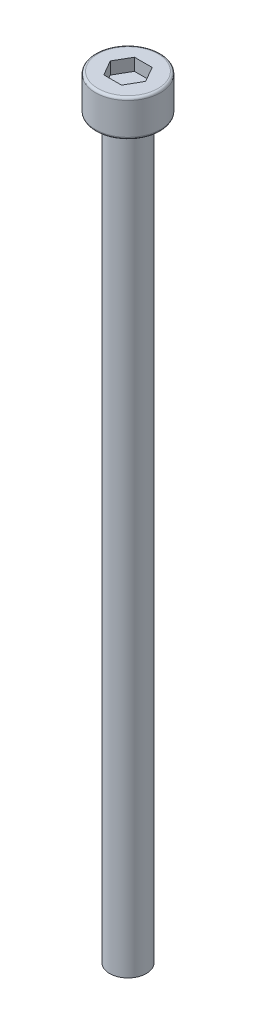
ISO-10303-21;
HEADER;
FILE_DESCRIPTION(('STEP AP214'),'2;1');
FILE_NAME('part.step','',(''),(''),'','','');
FILE_SCHEMA(('AUTOMOTIVE_DESIGN { 1 0 10303 214 1 1 1 1 }'));
ENDSEC;
DATA;
#1=APPLICATION_CONTEXT('core data for automotive mechanical design processes');
#2=APPLICATION_PROTOCOL_DEFINITION('international standard','automotive_design',2000,#1);
#3=PRODUCT_CONTEXT('',#1,'mechanical');
#4=PRODUCT('Part','Part','',(#3));
#5=PRODUCT_RELATED_PRODUCT_CATEGORY('part','',(#4));
#6=PRODUCT_DEFINITION_FORMATION('','',#4);
#7=PRODUCT_DEFINITION_CONTEXT('part definition',#1,'design');
#8=PRODUCT_DEFINITION('design','',#6,#7);
#9=PRODUCT_DEFINITION_SHAPE('','',#8);
#10=(LENGTH_UNIT() NAMED_UNIT(*) SI_UNIT(.MILLI.,.METRE.));
#11=(NAMED_UNIT(*) PLANE_ANGLE_UNIT() SI_UNIT($,.RADIAN.));
#12=(NAMED_UNIT(*) SI_UNIT($,.STERADIAN.) SOLID_ANGLE_UNIT());
#13=UNCERTAINTY_MEASURE_WITH_UNIT(LENGTH_MEASURE(1.E-05),#10,'distance_accuracy_value','');
#14=(GEOMETRIC_REPRESENTATION_CONTEXT(3) GLOBAL_UNCERTAINTY_ASSIGNED_CONTEXT((#13)) GLOBAL_UNIT_ASSIGNED_CONTEXT((#10,
#11,#12)) REPRESENTATION_CONTEXT('',''));
#15=CARTESIAN_POINT('',(0.,0.,0.));
#16=DIRECTION('',(0.,0.,1.));
#17=DIRECTION('',(1.,0.,0.));
#18=AXIS2_PLACEMENT_3D('',#15,#16,#17);
#19=CARTESIAN_POINT('',(0.,3.,0.));
#20=DIRECTION('',(0.,-1.,0.));
#21=DIRECTION('',(0.,0.,-1.));
#22=AXIS2_PLACEMENT_3D('',#19,#20,#21);
#23=CYLINDRICAL_SURFACE('',#22,2.65);
#24=CARTESIAN_POINT('',(0.,0.2,0.));
#25=DIRECTION('',(0.,1.,0.));
#26=DIRECTION('',(0.,0.,1.));
#27=AXIS2_PLACEMENT_3D('',#24,#25,#26);
#28=CIRCLE('',#27,2.65);
#29=CARTESIAN_POINT('',(0.,0.2,2.65));
#30=VERTEX_POINT('',#29);
#31=EDGE_CURVE('E145',#30,#30,#28,.T.);
#32=ORIENTED_EDGE('',*,*,#31,.T.);
#33=EDGE_LOOP('',(#32));
#34=FACE_BOUND('',#33,.T.);
#35=CARTESIAN_POINT('',(0.,2.8,0.));
#36=DIRECTION('',(0.,1.,0.));
#37=DIRECTION('',(0.,0.,1.));
#38=AXIS2_PLACEMENT_3D('',#35,#36,#37);
#39=CIRCLE('',#38,2.65);
#40=CARTESIAN_POINT('',(0.,2.8,2.65));
#41=VERTEX_POINT('',#40);
#42=EDGE_CURVE('E142',#41,#41,#39,.F.);
#43=ORIENTED_EDGE('',*,*,#42,.T.);
#44=EDGE_LOOP('',(#43));
#45=FACE_BOUND('',#44,.T.);
#46=ADVANCED_FACE('F33',(#34,#45),#23,.T.);
#47=CARTESIAN_POINT('',(0.,3.,0.));
#48=DIRECTION('',(0.,1.,0.));
#49=DIRECTION('',(0.,0.,1.));
#50=AXIS2_PLACEMENT_3D('',#47,#48,#49);
#51=PLANE('',#50);
#52=CARTESIAN_POINT('',(0.,3.,0.));
#53=DIRECTION('',(0.,1.,0.));
#54=DIRECTION('',(0.,0.,1.));
#55=AXIS2_PLACEMENT_3D('',#52,#53,#54);
#56=CIRCLE('',#55,2.45);
#57=CARTESIAN_POINT('',(0.,3.,2.45));
#58=VERTEX_POINT('',#57);
#59=EDGE_CURVE('E11',#58,#58,#56,.T.);
#60=ORIENTED_EDGE('',*,*,#59,.T.);
#61=EDGE_LOOP('',(#60));
#62=FACE_BOUND('',#61,.T.);
#63=DIRECTION('',(0.5,0.,-0.866025403784439));
#64=VECTOR('',#63,1.);
#65=CARTESIAN_POINT('',(0.721687836487032,3.,1.25));
#66=LINE('',#65,#64);
#67=CARTESIAN_POINT('',(0.721687836487032,3.,1.25));
#68=VERTEX_POINT('',#67);
#69=CARTESIAN_POINT('',(1.44337567297406,3.,0.));
#70=VERTEX_POINT('',#69);
#71=EDGE_CURVE('E48',#68,#70,#66,.T.);
#72=ORIENTED_EDGE('',*,*,#71,.F.);
#73=DIRECTION('',(1.,0.,0.));
#74=VECTOR('',#73,1.);
#75=CARTESIAN_POINT('',(-0.721687836487032,3.,1.25));
#76=LINE('',#75,#74);
#77=CARTESIAN_POINT('',(-0.721687836487032,3.,1.25));
#78=VERTEX_POINT('',#77);
#79=EDGE_CURVE('E132',#78,#68,#76,.T.);
#80=ORIENTED_EDGE('',*,*,#79,.F.);
#81=DIRECTION('',(0.5,0.,0.866025403784439));
#82=VECTOR('',#81,1.);
#83=CARTESIAN_POINT('',(-1.44337567297406,3.,0.));
#84=LINE('',#83,#82);
#85=CARTESIAN_POINT('',(-1.44337567297406,3.,0.));
#86=VERTEX_POINT('',#85);
#87=EDGE_CURVE('E130',#86,#78,#84,.T.);
#88=ORIENTED_EDGE('',*,*,#87,.F.);
#89=DIRECTION('',(-0.5,0.,0.866025403784439));
#90=VECTOR('',#89,1.);
#91=CARTESIAN_POINT('',(-0.721687836487032,3.,-1.25));
#92=LINE('',#91,#90);
#93=CARTESIAN_POINT('',(-0.721687836487032,3.,-1.25));
#94=VERTEX_POINT('',#93);
#95=EDGE_CURVE('E96',#94,#86,#92,.T.);
#96=ORIENTED_EDGE('',*,*,#95,.F.);
#97=DIRECTION('',(-1.,0.,0.));
#98=VECTOR('',#97,1.);
#99=CARTESIAN_POINT('',(0.721687836487032,3.,-1.25));
#100=LINE('',#99,#98);
#101=CARTESIAN_POINT('',(0.721687836487032,3.,-1.25));
#102=VERTEX_POINT('',#101);
#103=EDGE_CURVE('E126',#102,#94,#100,.T.);
#104=ORIENTED_EDGE('',*,*,#103,.F.);
#105=DIRECTION('',(-0.5,0.,-0.866025403784438));
#106=VECTOR('',#105,1.);
#107=CARTESIAN_POINT('',(1.44337567297406,3.,0.));
#108=LINE('',#107,#106);
#109=EDGE_CURVE('E122',#70,#102,#108,.T.);
#110=ORIENTED_EDGE('',*,*,#109,.F.);
#111=EDGE_LOOP('',(#72,#80,#88,#96,#104,#110));
#112=FACE_BOUND('',#111,.T.);
#113=ADVANCED_FACE('F161',(#62,#112),#51,.T.);
#114=CARTESIAN_POINT('',(0.,0.,0.));
#115=DIRECTION('',(0.,1.,0.));
#116=DIRECTION('',(0.,0.,1.));
#117=AXIS2_PLACEMENT_3D('',#114,#115,#116);
#118=PLANE('',#117);
#119=CARTESIAN_POINT('',(0.,0.,0.));
#120=DIRECTION('',(0.,1.,0.));
#121=DIRECTION('',(0.,0.,1.));
#122=AXIS2_PLACEMENT_3D('',#119,#120,#121);
#123=CIRCLE('',#122,2.45);
#124=CARTESIAN_POINT('',(0.,0.,2.45));
#125=VERTEX_POINT('',#124);
#126=EDGE_CURVE('E41',#125,#125,#123,.F.);
#127=ORIENTED_EDGE('',*,*,#126,.T.);
#128=EDGE_LOOP('',(#127));
#129=FACE_BOUND('',#128,.T.);
#130=CARTESIAN_POINT('',(0.,0.,0.));
#131=DIRECTION('',(0.,-1.,0.));
#132=DIRECTION('',(0.,0.,-1.));
#133=AXIS2_PLACEMENT_3D('',#130,#131,#132);
#134=CIRCLE('',#133,1.5);
#135=CARTESIAN_POINT('',(0.,0.,-1.5));
#136=VERTEX_POINT('',#135);
#137=EDGE_CURVE('E136',#136,#136,#134,.T.);
#138=ORIENTED_EDGE('',*,*,#137,.F.);
#139=EDGE_LOOP('',(#138));
#140=FACE_BOUND('',#139,.T.);
#141=ADVANCED_FACE('F150',(#129,#140),#118,.F.);
#142=CARTESIAN_POINT('',(0.721687836487032,2.,1.25));
#143=DIRECTION('',(0.866025403784439,0.,0.5));
#144=DIRECTION('',(0.5,0.,-0.866025403784439));
#145=AXIS2_PLACEMENT_3D('',#142,#143,#144);
#146=PLANE('',#145);
#147=ORIENTED_EDGE('',*,*,#71,.T.);
#148=DIRECTION('',(0.,1.,0.));
#149=VECTOR('',#148,1.);
#150=CARTESIAN_POINT('',(1.44337567297406,2.,0.));
#151=LINE('',#150,#149);
#152=CARTESIAN_POINT('',(1.44337567297406,2.,0.));
#153=VERTEX_POINT('',#152);
#154=EDGE_CURVE('E78',#153,#70,#151,.T.);
#155=ORIENTED_EDGE('',*,*,#154,.F.);
#156=DIRECTION('',(0.5,0.,-0.866025403784439));
#157=VECTOR('',#156,1.);
#158=CARTESIAN_POINT('',(0.721687836487032,2.,1.25));
#159=LINE('',#158,#157);
#160=CARTESIAN_POINT('',(0.721687836487032,2.,1.25));
#161=VERTEX_POINT('',#160);
#162=EDGE_CURVE('E134',#161,#153,#159,.T.);
#163=ORIENTED_EDGE('',*,*,#162,.F.);
#164=DIRECTION('',(0.,1.,0.));
#165=VECTOR('',#164,1.);
#166=CARTESIAN_POINT('',(0.721687836487032,2.,1.25));
#167=LINE('',#166,#165);
#168=EDGE_CURVE('E56',#161,#68,#167,.T.);
#169=ORIENTED_EDGE('',*,*,#168,.T.);
#170=EDGE_LOOP('',(#147,#155,#163,#169));
#171=FACE_BOUND('',#170,.T.);
#172=ADVANCED_FACE('F191',(#171),#146,.F.);
#173=CARTESIAN_POINT('',(-0.721687836487032,2.,1.25));
#174=DIRECTION('',(0.,0.,1.));
#175=DIRECTION('',(1.,0.,0.));
#176=AXIS2_PLACEMENT_3D('',#173,#174,#175);
#177=PLANE('',#176);
#178=ORIENTED_EDGE('',*,*,#79,.T.);
#179=ORIENTED_EDGE('',*,*,#168,.F.);
#180=DIRECTION('',(1.,0.,0.));
#181=VECTOR('',#180,1.);
#182=CARTESIAN_POINT('',(-0.721687836487032,2.,1.25));
#183=LINE('',#182,#181);
#184=CARTESIAN_POINT('',(-0.721687836487032,2.,1.25));
#185=VERTEX_POINT('',#184);
#186=EDGE_CURVE('E108',#185,#161,#183,.T.);
#187=ORIENTED_EDGE('',*,*,#186,.F.);
#188=DIRECTION('',(0.,1.,0.));
#189=VECTOR('',#188,1.);
#190=CARTESIAN_POINT('',(-0.721687836487032,2.,1.25));
#191=LINE('',#190,#189);
#192=EDGE_CURVE('E100',#185,#78,#191,.T.);
#193=ORIENTED_EDGE('',*,*,#192,.T.);
#194=EDGE_LOOP('',(#178,#179,#187,#193));
#195=FACE_BOUND('',#194,.T.);
#196=ADVANCED_FACE('F196',(#195),#177,.F.);
#197=CARTESIAN_POINT('',(-1.44337567297406,2.,0.));
#198=DIRECTION('',(-0.866025403784439,0.,0.5));
#199=DIRECTION('',(0.5,0.,0.866025403784439));
#200=AXIS2_PLACEMENT_3D('',#197,#198,#199);
#201=PLANE('',#200);
#202=ORIENTED_EDGE('',*,*,#87,.T.);
#203=ORIENTED_EDGE('',*,*,#192,.F.);
#204=DIRECTION('',(0.5,0.,0.866025403784439));
#205=VECTOR('',#204,1.);
#206=CARTESIAN_POINT('',(-1.44337567297406,2.,0.));
#207=LINE('',#206,#205);
#208=CARTESIAN_POINT('',(-1.44337567297406,2.,0.));
#209=VERTEX_POINT('',#208);
#210=EDGE_CURVE('E104',#209,#185,#207,.T.);
#211=ORIENTED_EDGE('',*,*,#210,.F.);
#212=DIRECTION('',(0.,1.,0.));
#213=VECTOR('',#212,1.);
#214=CARTESIAN_POINT('',(-1.44337567297406,2.,0.));
#215=LINE('',#214,#213);
#216=EDGE_CURVE('E89',#209,#86,#215,.T.);
#217=ORIENTED_EDGE('',*,*,#216,.T.);
#218=EDGE_LOOP('',(#202,#203,#211,#217));
#219=FACE_BOUND('',#218,.T.);
#220=ADVANCED_FACE('F105',(#219),#201,.F.);
#221=CARTESIAN_POINT('',(-0.721687836487032,2.,-1.25));
#222=DIRECTION('',(-0.866025403784439,0.,-0.5));
#223=DIRECTION('',(-0.5,0.,0.866025403784439));
#224=AXIS2_PLACEMENT_3D('',#221,#222,#223);
#225=PLANE('',#224);
#226=ORIENTED_EDGE('',*,*,#95,.T.);
#227=ORIENTED_EDGE('',*,*,#216,.F.);
#228=DIRECTION('',(-0.5,0.,0.866025403784439));
#229=VECTOR('',#228,1.);
#230=CARTESIAN_POINT('',(-0.721687836487032,2.,-1.25));
#231=LINE('',#230,#229);
#232=CARTESIAN_POINT('',(-0.721687836487032,2.,-1.25));
#233=VERTEX_POINT('',#232);
#234=EDGE_CURVE('E93',#233,#209,#231,.T.);
#235=ORIENTED_EDGE('',*,*,#234,.F.);
#236=DIRECTION('',(0.,1.,0.));
#237=VECTOR('',#236,1.);
#238=CARTESIAN_POINT('',(-0.721687836487032,2.,-1.25));
#239=LINE('',#238,#237);
#240=EDGE_CURVE('E101',#233,#94,#239,.T.);
#241=ORIENTED_EDGE('',*,*,#240,.T.);
#242=EDGE_LOOP('',(#226,#227,#235,#241));
#243=FACE_BOUND('',#242,.T.);
#244=ADVANCED_FACE('F91',(#243),#225,.F.);
#245=CARTESIAN_POINT('',(0.721687836487032,2.,-1.25));
#246=DIRECTION('',(0.,0.,-1.));
#247=DIRECTION('',(-1.,0.,0.));
#248=AXIS2_PLACEMENT_3D('',#245,#246,#247);
#249=PLANE('',#248);
#250=ORIENTED_EDGE('',*,*,#103,.T.);
#251=ORIENTED_EDGE('',*,*,#240,.F.);
#252=DIRECTION('',(-1.,0.,0.));
#253=VECTOR('',#252,1.);
#254=CARTESIAN_POINT('',(0.721687836487032,2.,-1.25));
#255=LINE('',#254,#253);
#256=CARTESIAN_POINT('',(0.721687836487032,2.,-1.25));
#257=VERTEX_POINT('',#256);
#258=EDGE_CURVE('E114',#257,#233,#255,.T.);
#259=ORIENTED_EDGE('',*,*,#258,.F.);
#260=DIRECTION('',(0.,1.,0.));
#261=VECTOR('',#260,1.);
#262=CARTESIAN_POINT('',(0.721687836487032,2.,-1.25));
#263=LINE('',#262,#261);
#264=EDGE_CURVE('E139',#257,#102,#263,.T.);
#265=ORIENTED_EDGE('',*,*,#264,.T.);
#266=EDGE_LOOP('',(#250,#251,#259,#265));
#267=FACE_BOUND('',#266,.T.);
#268=ADVANCED_FACE('F201',(#267),#249,.F.);
#269=CARTESIAN_POINT('',(1.44337567297406,2.,0.));
#270=DIRECTION('',(0.866025403784438,0.,-0.5));
#271=DIRECTION('',(-0.5,0.,-0.866025403784439));
#272=AXIS2_PLACEMENT_3D('',#269,#270,#271);
#273=PLANE('',#272);
#274=ORIENTED_EDGE('',*,*,#109,.T.);
#275=ORIENTED_EDGE('',*,*,#264,.F.);
#276=DIRECTION('',(-0.5,0.,-0.866025403784438));
#277=VECTOR('',#276,1.);
#278=CARTESIAN_POINT('',(1.44337567297406,2.,0.));
#279=LINE('',#278,#277);
#280=EDGE_CURVE('E116',#153,#257,#279,.T.);
#281=ORIENTED_EDGE('',*,*,#280,.F.);
#282=ORIENTED_EDGE('',*,*,#154,.T.);
#283=EDGE_LOOP('',(#274,#275,#281,#282));
#284=FACE_BOUND('',#283,.T.);
#285=ADVANCED_FACE('F176',(#284),#273,.F.);
#286=CARTESIAN_POINT('',(0.,2.,0.));
#287=DIRECTION('',(0.,1.,0.));
#288=DIRECTION('',(0.,0.,1.));
#289=AXIS2_PLACEMENT_3D('',#286,#287,#288);
#290=PLANE('',#289);
#291=ORIENTED_EDGE('',*,*,#162,.T.);
#292=ORIENTED_EDGE('',*,*,#280,.T.);
#293=ORIENTED_EDGE('',*,*,#258,.T.);
#294=ORIENTED_EDGE('',*,*,#234,.T.);
#295=ORIENTED_EDGE('',*,*,#210,.T.);
#296=ORIENTED_EDGE('',*,*,#186,.T.);
#297=EDGE_LOOP('',(#291,#292,#293,#294,#295,#296));
#298=FACE_BOUND('',#297,.T.);
#299=ADVANCED_FACE('F111',(#298),#290,.T.);
#300=CARTESIAN_POINT('',(0.,-60.,0.));
#301=DIRECTION('',(0.,1.,0.));
#302=DIRECTION('',(0.,0.,1.));
#303=AXIS2_PLACEMENT_3D('',#300,#301,#302);
#304=CYLINDRICAL_SURFACE('',#303,1.5);
#305=CARTESIAN_POINT('',(0.,-60.,0.));
#306=DIRECTION('',(0.,-1.,0.));
#307=DIRECTION('',(0.,0.,-1.));
#308=AXIS2_PLACEMENT_3D('',#305,#306,#307);
#309=CIRCLE('',#308,1.5);
#310=CARTESIAN_POINT('',(0.,-60.,-1.5));
#311=VERTEX_POINT('',#310);
#312=EDGE_CURVE('E123',#311,#311,#309,.T.);
#313=ORIENTED_EDGE('',*,*,#312,.F.);
#314=EDGE_LOOP('',(#313));
#315=FACE_BOUND('',#314,.T.);
#316=ORIENTED_EDGE('',*,*,#137,.T.);
#317=EDGE_LOOP('',(#316));
#318=FACE_BOUND('',#317,.T.);
#319=ADVANCED_FACE('F185',(#315,#318),#304,.T.);
#320=CARTESIAN_POINT('',(0.,-60.,0.));
#321=DIRECTION('',(0.,-1.,0.));
#322=DIRECTION('',(0.,0.,-1.));
#323=AXIS2_PLACEMENT_3D('',#320,#321,#322);
#324=PLANE('',#323);
#325=ORIENTED_EDGE('',*,*,#312,.T.);
#326=EDGE_LOOP('',(#325));
#327=FACE_BOUND('',#326,.T.);
#328=ADVANCED_FACE('F156',(#327),#324,.T.);
#329=CARTESIAN_POINT('',(0.,0.2,0.));
#330=DIRECTION('',(0.,1.,0.));
#331=DIRECTION('',(0.,0.,1.));
#332=AXIS2_PLACEMENT_3D('',#329,#330,#331);
#333=TOROIDAL_SURFACE('',#332,2.45,0.2);
#334=ORIENTED_EDGE('',*,*,#126,.F.);
#335=EDGE_LOOP('',(#334));
#336=FACE_BOUND('',#335,.T.);
#337=ORIENTED_EDGE('',*,*,#31,.F.);
#338=EDGE_LOOP('',(#337));
#339=FACE_BOUND('',#338,.T.);
#340=ADVANCED_FACE('F153',(#336,#339),#333,.T.);
#341=CARTESIAN_POINT('',(0.,2.8,0.));
#342=DIRECTION('',(0.,1.,0.));
#343=DIRECTION('',(0.,0.,1.));
#344=AXIS2_PLACEMENT_3D('',#341,#342,#343);
#345=TOROIDAL_SURFACE('',#344,2.45,0.2);
#346=ORIENTED_EDGE('',*,*,#42,.F.);
#347=EDGE_LOOP('',(#346));
#348=FACE_BOUND('',#347,.T.);
#349=ORIENTED_EDGE('',*,*,#59,.F.);
#350=EDGE_LOOP('',(#349));
#351=FACE_BOUND('',#350,.T.);
#352=ADVANCED_FACE('F35',(#348,#351),#345,.T.);
#353=CLOSED_SHELL('',(#46,#113,#141,#172,#196,#220,#244,#268,#285,#299,#319,#328,#340,#352));
#354=MANIFOLD_SOLID_BREP('B2',#353);
#355=ADVANCED_BREP_SHAPE_REPRESENTATION('',(#18,#354),#14);
#356=SHAPE_DEFINITION_REPRESENTATION(#9,#355);
ENDSEC;
END-ISO-10303-21;
